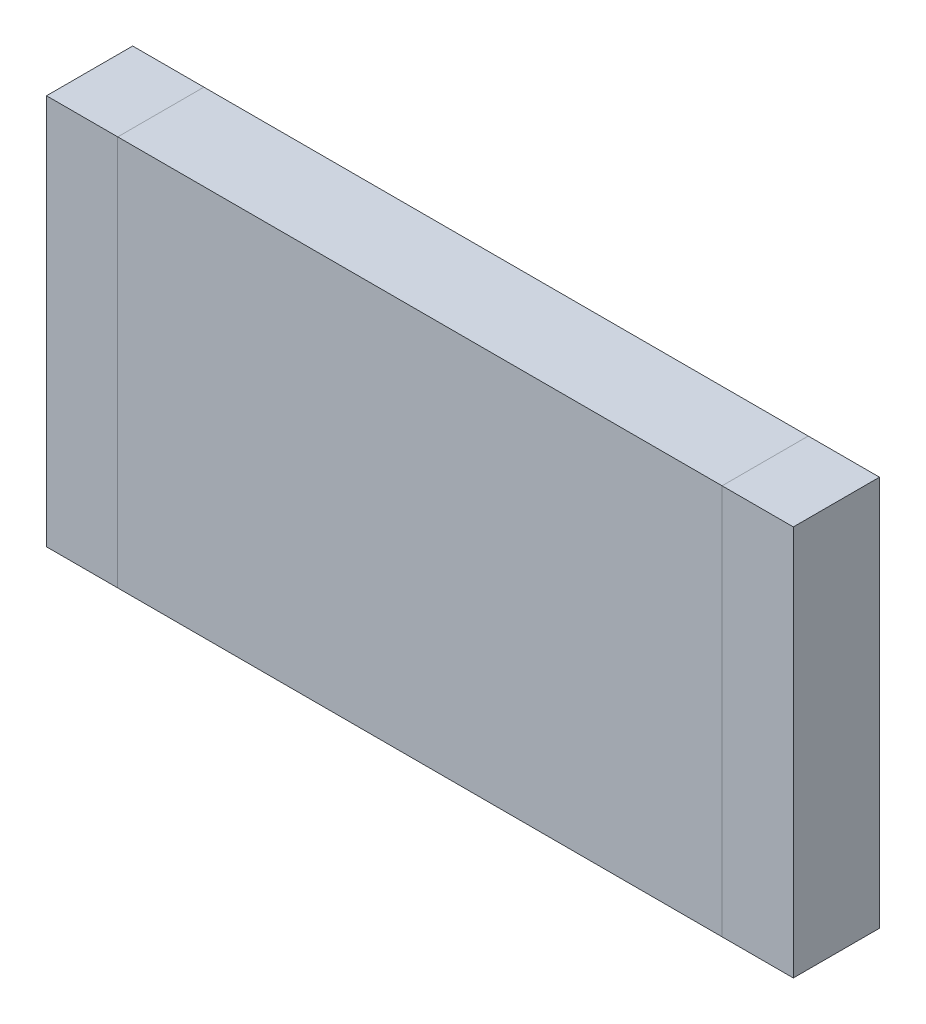
ISO-10303-21;
HEADER;
FILE_DESCRIPTION(('STEP AP214'),'2;1');
FILE_NAME('part.step','',(''),(''),'','','');
FILE_SCHEMA(('AUTOMOTIVE_DESIGN { 1 0 10303 214 1 1 1 1 }'));
ENDSEC;
DATA;
#1=APPLICATION_CONTEXT('core data for automotive mechanical design processes');
#2=APPLICATION_PROTOCOL_DEFINITION('international standard','automotive_design',2000,#1);
#3=PRODUCT_CONTEXT('',#1,'mechanical');
#4=PRODUCT('Part','Part','',(#3));
#5=PRODUCT_RELATED_PRODUCT_CATEGORY('part','',(#4));
#6=PRODUCT_DEFINITION_FORMATION('','',#4);
#7=PRODUCT_DEFINITION_CONTEXT('part definition',#1,'design');
#8=PRODUCT_DEFINITION('design','',#6,#7);
#9=PRODUCT_DEFINITION_SHAPE('','',#8);
#10=(LENGTH_UNIT() NAMED_UNIT(*) SI_UNIT(.MILLI.,.METRE.));
#11=(NAMED_UNIT(*) PLANE_ANGLE_UNIT() SI_UNIT($,.RADIAN.));
#12=(NAMED_UNIT(*) SI_UNIT($,.STERADIAN.) SOLID_ANGLE_UNIT());
#13=UNCERTAINTY_MEASURE_WITH_UNIT(LENGTH_MEASURE(1.E-05),#10,'distance_accuracy_value','');
#14=(GEOMETRIC_REPRESENTATION_CONTEXT(3) GLOBAL_UNCERTAINTY_ASSIGNED_CONTEXT((#13)) GLOBAL_UNIT_ASSIGNED_CONTEXT((#10,
#11,#12)) REPRESENTATION_CONTEXT('',''));
#15=CARTESIAN_POINT('',(0.,0.,0.));
#16=DIRECTION('',(0.,0.,1.));
#17=DIRECTION('',(1.,0.,0.));
#18=AXIS2_PLACEMENT_3D('',#15,#16,#17);
#19=CARTESIAN_POINT('',(-3.2499173,-1.69991786,0.));
#20=DIRECTION('',(-1.,0.,0.));
#21=DIRECTION('',(0.,1.,0.));
#22=AXIS2_PLACEMENT_3D('',#19,#20,#21);
#23=PLANE('',#22);
#24=DIRECTION('',(0.,0.,1.));
#25=VECTOR('',#24,1.);
#26=CARTESIAN_POINT('',(-3.2499173,-1.69991786,0.));
#27=LINE('',#26,#25);
#28=CARTESIAN_POINT('',(-3.2499173,-1.69991786,0.));
#29=VERTEX_POINT('',#28);
#30=CARTESIAN_POINT('',(-3.2499173,-1.69991786,0.75000104));
#31=VERTEX_POINT('',#30);
#32=EDGE_CURVE('P0_E11',#29,#31,#27,.T.);
#33=ORIENTED_EDGE('',*,*,#32,.T.);
#34=DIRECTION('',(0.,1.,0.));
#35=VECTOR('',#34,1.);
#36=CARTESIAN_POINT('',(-3.2499173,-1.69991786,0.75000104));
#37=LINE('',#36,#35);
#38=CARTESIAN_POINT('',(-3.2499173,1.70008042,0.75000104));
#39=VERTEX_POINT('',#38);
#40=EDGE_CURVE('P0_E24',#31,#39,#37,.T.);
#41=ORIENTED_EDGE('',*,*,#40,.T.);
#42=DIRECTION('',(0.,0.,1.));
#43=VECTOR('',#42,1.);
#44=CARTESIAN_POINT('',(-3.2499173,1.70008042,0.));
#45=LINE('',#44,#43);
#46=CARTESIAN_POINT('',(-3.2499173,1.70008042,0.));
#47=VERTEX_POINT('',#46);
#48=EDGE_CURVE('P0_E85',#47,#39,#45,.T.);
#49=ORIENTED_EDGE('',*,*,#48,.F.);
#50=DIRECTION('',(0.,1.,0.));
#51=VECTOR('',#50,1.);
#52=CARTESIAN_POINT('',(-3.2499173,-1.69991786,0.));
#53=LINE('',#52,#51);
#54=EDGE_CURVE('P0_E83',#29,#47,#53,.T.);
#55=ORIENTED_EDGE('',*,*,#54,.F.);
#56=EDGE_LOOP('',(#33,#41,#49,#55));
#57=FACE_BOUND('',#56,.T.);
#58=ADVANCED_FACE('P0_F17',(#57),#23,.T.);
#59=CARTESIAN_POINT('',(-3.2499173,1.70008042,0.));
#60=DIRECTION('',(0.,1.,0.));
#61=DIRECTION('',(1.,0.,0.));
#62=AXIS2_PLACEMENT_3D('',#59,#60,#61);
#63=PLANE('',#62);
#64=ORIENTED_EDGE('',*,*,#48,.T.);
#65=DIRECTION('',(1.,0.,0.));
#66=VECTOR('',#65,1.);
#67=CARTESIAN_POINT('',(-3.2499173,1.70008042,0.75000104));
#68=LINE('',#67,#66);
#69=CARTESIAN_POINT('',(-2.62991854,1.70008042,0.75000104));
#70=VERTEX_POINT('',#69);
#71=EDGE_CURVE('P0_E81',#39,#70,#68,.T.);
#72=ORIENTED_EDGE('',*,*,#71,.T.);
#73=DIRECTION('',(0.,0.,1.));
#74=VECTOR('',#73,1.);
#75=CARTESIAN_POINT('',(-2.62991854,1.70008042,0.));
#76=LINE('',#75,#74);
#77=CARTESIAN_POINT('',(-2.62991854,1.70008042,0.));
#78=VERTEX_POINT('',#77);
#79=EDGE_CURVE('P0_E79',#78,#70,#76,.T.);
#80=ORIENTED_EDGE('',*,*,#79,.F.);
#81=DIRECTION('',(1.,0.,0.));
#82=VECTOR('',#81,1.);
#83=CARTESIAN_POINT('',(-3.2499173,1.70008042,0.));
#84=LINE('',#83,#82);
#85=EDGE_CURVE('P0_E70',#47,#78,#84,.T.);
#86=ORIENTED_EDGE('',*,*,#85,.F.);
#87=EDGE_LOOP('',(#64,#72,#80,#86));
#88=FACE_BOUND('',#87,.T.);
#89=ADVANCED_FACE('P0_F90',(#88),#63,.T.);
#90=CARTESIAN_POINT('',(-2.62991854,1.70008042,0.));
#91=DIRECTION('',(1.,0.,0.));
#92=DIRECTION('',(0.,-1.,0.));
#93=AXIS2_PLACEMENT_3D('',#90,#91,#92);
#94=PLANE('',#93);
#95=ORIENTED_EDGE('',*,*,#79,.T.);
#96=DIRECTION('',(0.,-1.,0.));
#97=VECTOR('',#96,1.);
#98=CARTESIAN_POINT('',(-2.62991854,1.70008042,0.75000104));
#99=LINE('',#98,#97);
#100=CARTESIAN_POINT('',(-2.62991854,-1.69991786,0.75000104));
#101=VERTEX_POINT('',#100);
#102=EDGE_CURVE('P0_E60',#70,#101,#99,.T.);
#103=ORIENTED_EDGE('',*,*,#102,.T.);
#104=DIRECTION('',(0.,0.,1.));
#105=VECTOR('',#104,1.);
#106=CARTESIAN_POINT('',(-2.62991854,-1.69991786,0.));
#107=LINE('',#106,#105);
#108=CARTESIAN_POINT('',(-2.62991854,-1.69991786,0.));
#109=VERTEX_POINT('',#108);
#110=EDGE_CURVE('P0_E54',#109,#101,#107,.T.);
#111=ORIENTED_EDGE('',*,*,#110,.F.);
#112=DIRECTION('',(0.,-1.,0.));
#113=VECTOR('',#112,1.);
#114=CARTESIAN_POINT('',(-2.62991854,1.70008042,0.));
#115=LINE('',#114,#113);
#116=EDGE_CURVE('P0_E58',#78,#109,#115,.T.);
#117=ORIENTED_EDGE('',*,*,#116,.F.);
#118=EDGE_LOOP('',(#95,#103,#111,#117));
#119=FACE_BOUND('',#118,.T.);
#120=ADVANCED_FACE('P0_F57',(#119),#94,.T.);
#121=CARTESIAN_POINT('',(-2.62991854,-1.69991786,0.));
#122=DIRECTION('',(0.,-1.,0.));
#123=DIRECTION('',(-1.,0.,0.));
#124=AXIS2_PLACEMENT_3D('',#121,#122,#123);
#125=PLANE('',#124);
#126=ORIENTED_EDGE('',*,*,#110,.T.);
#127=DIRECTION('',(-1.,0.,0.));
#128=VECTOR('',#127,1.);
#129=CARTESIAN_POINT('',(-2.62991854,-1.69991786,0.75000104));
#130=LINE('',#129,#128);
#131=EDGE_CURVE('P0_E71',#101,#31,#130,.T.);
#132=ORIENTED_EDGE('',*,*,#131,.T.);
#133=ORIENTED_EDGE('',*,*,#32,.F.);
#134=DIRECTION('',(-1.,0.,0.));
#135=VECTOR('',#134,1.);
#136=CARTESIAN_POINT('',(-2.62991854,-1.69991786,0.));
#137=LINE('',#136,#135);
#138=EDGE_CURVE('P0_E68',#109,#29,#137,.T.);
#139=ORIENTED_EDGE('',*,*,#138,.F.);
#140=EDGE_LOOP('',(#126,#132,#133,#139));
#141=FACE_BOUND('',#140,.T.);
#142=ADVANCED_FACE('P0_F73',(#141),#125,.T.);
#143=CARTESIAN_POINT('',(-2.93991792,8.12800000016847E-05,0.));
#144=DIRECTION('',(0.,0.,-1.));
#145=DIRECTION('',(0.,1.,0.));
#146=AXIS2_PLACEMENT_3D('',#143,#144,#145);
#147=PLANE('',#146);
#148=ORIENTED_EDGE('',*,*,#54,.T.);
#149=ORIENTED_EDGE('',*,*,#85,.T.);
#150=ORIENTED_EDGE('',*,*,#116,.T.);
#151=ORIENTED_EDGE('',*,*,#138,.T.);
#152=EDGE_LOOP('',(#148,#149,#150,#151));
#153=FACE_BOUND('',#152,.T.);
#154=ADVANCED_FACE('P0_F67',(#153),#147,.T.);
#155=CARTESIAN_POINT('',(-2.93991792,8.12800000016847E-05,0.75000104));
#156=DIRECTION('',(0.,0.,-1.));
#157=DIRECTION('',(0.,1.,0.));
#158=AXIS2_PLACEMENT_3D('',#155,#156,#157);
#159=PLANE('',#158);
#160=ORIENTED_EDGE('',*,*,#131,.F.);
#161=ORIENTED_EDGE('',*,*,#102,.F.);
#162=ORIENTED_EDGE('',*,*,#71,.F.);
#163=ORIENTED_EDGE('',*,*,#40,.F.);
#164=EDGE_LOOP('',(#160,#161,#162,#163));
#165=FACE_BOUND('',#164,.T.);
#166=ADVANCED_FACE('P0_F91',(#165),#159,.F.);
#167=CLOSED_SHELL('',(#58,#89,#120,#142,#154,#166));
#168=MANIFOLD_SOLID_BREP('P0_B1',#167);
#169=CARTESIAN_POINT('',(-2.62991854,-1.69991786,0.));
#170=DIRECTION('',(-1.,0.,0.));
#171=DIRECTION('',(0.,1.,0.));
#172=AXIS2_PLACEMENT_3D('',#169,#170,#171);
#173=PLANE('',#172);
#174=DIRECTION('',(0.,0.,1.));
#175=VECTOR('',#174,1.);
#176=CARTESIAN_POINT('',(-2.62991854,-1.69991786,0.));
#177=LINE('',#176,#175);
#178=CARTESIAN_POINT('',(-2.62991854,-1.69991786,0.));
#179=VERTEX_POINT('',#178);
#180=CARTESIAN_POINT('',(-2.62991854,-1.69991786,0.75000104));
#181=VERTEX_POINT('',#180);
#182=EDGE_CURVE('P1_E11',#179,#181,#177,.T.);
#183=ORIENTED_EDGE('',*,*,#182,.T.);
#184=DIRECTION('',(0.,1.,0.));
#185=VECTOR('',#184,1.);
#186=CARTESIAN_POINT('',(-2.62991854,-1.69991786,0.75000104));
#187=LINE('',#186,#185);
#188=CARTESIAN_POINT('',(-2.62991854,1.70008042,0.75000104));
#189=VERTEX_POINT('',#188);
#190=EDGE_CURVE('P1_E24',#181,#189,#187,.T.);
#191=ORIENTED_EDGE('',*,*,#190,.T.);
#192=DIRECTION('',(0.,0.,1.));
#193=VECTOR('',#192,1.);
#194=CARTESIAN_POINT('',(-2.62991854,1.70008042,0.));
#195=LINE('',#194,#193);
#196=CARTESIAN_POINT('',(-2.62991854,1.70008042,0.));
#197=VERTEX_POINT('',#196);
#198=EDGE_CURVE('P1_E85',#197,#189,#195,.T.);
#199=ORIENTED_EDGE('',*,*,#198,.F.);
#200=DIRECTION('',(0.,1.,0.));
#201=VECTOR('',#200,1.);
#202=CARTESIAN_POINT('',(-2.62991854,-1.69991786,0.));
#203=LINE('',#202,#201);
#204=EDGE_CURVE('P1_E83',#179,#197,#203,.T.);
#205=ORIENTED_EDGE('',*,*,#204,.F.);
#206=EDGE_LOOP('',(#183,#191,#199,#205));
#207=FACE_BOUND('',#206,.T.);
#208=ADVANCED_FACE('P1_F17',(#207),#173,.T.);
#209=CARTESIAN_POINT('',(-2.62991854,1.70008042,0.));
#210=DIRECTION('',(0.,1.,0.));
#211=DIRECTION('',(1.,0.,0.));
#212=AXIS2_PLACEMENT_3D('',#209,#210,#211);
#213=PLANE('',#212);
#214=ORIENTED_EDGE('',*,*,#198,.T.);
#215=DIRECTION('',(1.,0.,0.));
#216=VECTOR('',#215,1.);
#217=CARTESIAN_POINT('',(-2.62991854,1.70008042,0.75000104));
#218=LINE('',#217,#216);
#219=CARTESIAN_POINT('',(2.6300811,1.70008042,0.75000104));
#220=VERTEX_POINT('',#219);
#221=EDGE_CURVE('P1_E81',#189,#220,#218,.T.);
#222=ORIENTED_EDGE('',*,*,#221,.T.);
#223=DIRECTION('',(0.,0.,1.));
#224=VECTOR('',#223,1.);
#225=CARTESIAN_POINT('',(2.6300811,1.70008042,0.));
#226=LINE('',#225,#224);
#227=CARTESIAN_POINT('',(2.6300811,1.70008042,0.));
#228=VERTEX_POINT('',#227);
#229=EDGE_CURVE('P1_E79',#228,#220,#226,.T.);
#230=ORIENTED_EDGE('',*,*,#229,.F.);
#231=DIRECTION('',(1.,0.,0.));
#232=VECTOR('',#231,1.);
#233=CARTESIAN_POINT('',(-2.62991854,1.70008042,0.));
#234=LINE('',#233,#232);
#235=EDGE_CURVE('P1_E70',#197,#228,#234,.T.);
#236=ORIENTED_EDGE('',*,*,#235,.F.);
#237=EDGE_LOOP('',(#214,#222,#230,#236));
#238=FACE_BOUND('',#237,.T.);
#239=ADVANCED_FACE('P1_F90',(#238),#213,.T.);
#240=CARTESIAN_POINT('',(2.6300811,1.70008042,0.));
#241=DIRECTION('',(1.,0.,0.));
#242=DIRECTION('',(0.,-1.,0.));
#243=AXIS2_PLACEMENT_3D('',#240,#241,#242);
#244=PLANE('',#243);
#245=ORIENTED_EDGE('',*,*,#229,.T.);
#246=DIRECTION('',(0.,-1.,0.));
#247=VECTOR('',#246,1.);
#248=CARTESIAN_POINT('',(2.6300811,1.70008042,0.75000104));
#249=LINE('',#248,#247);
#250=CARTESIAN_POINT('',(2.6300811,-1.69991786,0.75000104));
#251=VERTEX_POINT('',#250);
#252=EDGE_CURVE('P1_E60',#220,#251,#249,.T.);
#253=ORIENTED_EDGE('',*,*,#252,.T.);
#254=DIRECTION('',(0.,0.,1.));
#255=VECTOR('',#254,1.);
#256=CARTESIAN_POINT('',(2.6300811,-1.69991786,0.));
#257=LINE('',#256,#255);
#258=CARTESIAN_POINT('',(2.6300811,-1.69991786,0.));
#259=VERTEX_POINT('',#258);
#260=EDGE_CURVE('P1_E54',#259,#251,#257,.T.);
#261=ORIENTED_EDGE('',*,*,#260,.F.);
#262=DIRECTION('',(0.,-1.,0.));
#263=VECTOR('',#262,1.);
#264=CARTESIAN_POINT('',(2.6300811,1.70008042,0.));
#265=LINE('',#264,#263);
#266=EDGE_CURVE('P1_E58',#228,#259,#265,.T.);
#267=ORIENTED_EDGE('',*,*,#266,.F.);
#268=EDGE_LOOP('',(#245,#253,#261,#267));
#269=FACE_BOUND('',#268,.T.);
#270=ADVANCED_FACE('P1_F57',(#269),#244,.T.);
#271=CARTESIAN_POINT('',(2.6300811,-1.69991786,0.));
#272=DIRECTION('',(0.,-1.,0.));
#273=DIRECTION('',(-1.,0.,0.));
#274=AXIS2_PLACEMENT_3D('',#271,#272,#273);
#275=PLANE('',#274);
#276=ORIENTED_EDGE('',*,*,#260,.T.);
#277=DIRECTION('',(-1.,0.,0.));
#278=VECTOR('',#277,1.);
#279=CARTESIAN_POINT('',(2.6300811,-1.69991786,0.75000104));
#280=LINE('',#279,#278);
#281=EDGE_CURVE('P1_E71',#251,#181,#280,.T.);
#282=ORIENTED_EDGE('',*,*,#281,.T.);
#283=ORIENTED_EDGE('',*,*,#182,.F.);
#284=DIRECTION('',(-1.,0.,0.));
#285=VECTOR('',#284,1.);
#286=CARTESIAN_POINT('',(2.6300811,-1.69991786,0.));
#287=LINE('',#286,#285);
#288=EDGE_CURVE('P1_E68',#259,#179,#287,.T.);
#289=ORIENTED_EDGE('',*,*,#288,.F.);
#290=EDGE_LOOP('',(#276,#282,#283,#289));
#291=FACE_BOUND('',#290,.T.);
#292=ADVANCED_FACE('P1_F73',(#291),#275,.T.);
#293=CARTESIAN_POINT('',(8.12799999982565E-05,8.12800000017435E-05,0.));
#294=DIRECTION('',(0.,0.,-1.));
#295=DIRECTION('',(0.,1.,0.));
#296=AXIS2_PLACEMENT_3D('',#293,#294,#295);
#297=PLANE('',#296);
#298=ORIENTED_EDGE('',*,*,#204,.T.);
#299=ORIENTED_EDGE('',*,*,#235,.T.);
#300=ORIENTED_EDGE('',*,*,#266,.T.);
#301=ORIENTED_EDGE('',*,*,#288,.T.);
#302=EDGE_LOOP('',(#298,#299,#300,#301));
#303=FACE_BOUND('',#302,.T.);
#304=ADVANCED_FACE('P1_F67',(#303),#297,.T.);
#305=CARTESIAN_POINT('',(8.12799999982565E-05,8.12800000017435E-05,0.75000104));
#306=DIRECTION('',(0.,0.,-1.));
#307=DIRECTION('',(0.,1.,0.));
#308=AXIS2_PLACEMENT_3D('',#305,#306,#307);
#309=PLANE('',#308);
#310=ORIENTED_EDGE('',*,*,#281,.F.);
#311=ORIENTED_EDGE('',*,*,#252,.F.);
#312=ORIENTED_EDGE('',*,*,#221,.F.);
#313=ORIENTED_EDGE('',*,*,#190,.F.);
#314=EDGE_LOOP('',(#310,#311,#312,#313));
#315=FACE_BOUND('',#314,.T.);
#316=ADVANCED_FACE('P1_F91',(#315),#309,.F.);
#317=CLOSED_SHELL('',(#208,#239,#270,#292,#304,#316));
#318=MANIFOLD_SOLID_BREP('P1_B1',#317);
#319=CARTESIAN_POINT('',(2.6300811,-1.69991786,0.));
#320=DIRECTION('',(-1.,0.,0.));
#321=DIRECTION('',(0.,1.,0.));
#322=AXIS2_PLACEMENT_3D('',#319,#320,#321);
#323=PLANE('',#322);
#324=DIRECTION('',(0.,0.,1.));
#325=VECTOR('',#324,1.);
#326=CARTESIAN_POINT('',(2.6300811,-1.69991786,0.));
#327=LINE('',#326,#325);
#328=CARTESIAN_POINT('',(2.6300811,-1.69991786,0.));
#329=VERTEX_POINT('',#328);
#330=CARTESIAN_POINT('',(2.6300811,-1.69991786,0.75000104));
#331=VERTEX_POINT('',#330);
#332=EDGE_CURVE('P2_E10',#329,#331,#327,.T.);
#333=ORIENTED_EDGE('',*,*,#332,.T.);
#334=DIRECTION('',(0.,1.,0.));
#335=VECTOR('',#334,1.);
#336=CARTESIAN_POINT('',(2.6300811,-1.69991786,0.75000104));
#337=LINE('',#336,#335);
#338=CARTESIAN_POINT('',(2.6300811,1.70008042,0.75000104));
#339=VERTEX_POINT('',#338);
#340=EDGE_CURVE('P2_E23',#331,#339,#337,.T.);
#341=ORIENTED_EDGE('',*,*,#340,.T.);
#342=DIRECTION('',(0.,0.,1.));
#343=VECTOR('',#342,1.);
#344=CARTESIAN_POINT('',(2.6300811,1.70008042,0.));
#345=LINE('',#344,#343);
#346=CARTESIAN_POINT('',(2.6300811,1.70008042,0.));
#347=VERTEX_POINT('',#346);
#348=EDGE_CURVE('P2_E83',#347,#339,#345,.T.);
#349=ORIENTED_EDGE('',*,*,#348,.F.);
#350=DIRECTION('',(0.,1.,0.));
#351=VECTOR('',#350,1.);
#352=CARTESIAN_POINT('',(2.6300811,-1.69991786,0.));
#353=LINE('',#352,#351);
#354=EDGE_CURVE('P2_E81',#329,#347,#353,.T.);
#355=ORIENTED_EDGE('',*,*,#354,.F.);
#356=EDGE_LOOP('',(#333,#341,#349,#355));
#357=FACE_BOUND('',#356,.T.);
#358=ADVANCED_FACE('P2_F16',(#357),#323,.T.);
#359=CARTESIAN_POINT('',(2.6300811,1.70008042,0.));
#360=DIRECTION('',(0.,1.,0.));
#361=DIRECTION('',(1.,0.,0.));
#362=AXIS2_PLACEMENT_3D('',#359,#360,#361);
#363=PLANE('',#362);
#364=ORIENTED_EDGE('',*,*,#348,.T.);
#365=DIRECTION('',(1.,0.,0.));
#366=VECTOR('',#365,1.);
#367=CARTESIAN_POINT('',(2.6300811,1.70008042,0.75000104));
#368=LINE('',#367,#366);
#369=CARTESIAN_POINT('',(3.25007986,1.70008042,0.75000104));
#370=VERTEX_POINT('',#369);
#371=EDGE_CURVE('P2_E78',#339,#370,#368,.T.);
#372=ORIENTED_EDGE('',*,*,#371,.T.);
#373=DIRECTION('',(0.,0.,1.));
#374=VECTOR('',#373,1.);
#375=CARTESIAN_POINT('',(3.25007986,1.70008042,0.));
#376=LINE('',#375,#374);
#377=CARTESIAN_POINT('',(3.25007986,1.70008042,0.));
#378=VERTEX_POINT('',#377);
#379=EDGE_CURVE('P2_E76',#378,#370,#376,.T.);
#380=ORIENTED_EDGE('',*,*,#379,.F.);
#381=DIRECTION('',(1.,0.,0.));
#382=VECTOR('',#381,1.);
#383=CARTESIAN_POINT('',(2.6300811,1.70008042,0.));
#384=LINE('',#383,#382);
#385=EDGE_CURVE('P2_E67',#347,#378,#384,.T.);
#386=ORIENTED_EDGE('',*,*,#385,.F.);
#387=EDGE_LOOP('',(#364,#372,#380,#386));
#388=FACE_BOUND('',#387,.T.);
#389=ADVANCED_FACE('P2_F89',(#388),#363,.T.);
#390=CARTESIAN_POINT('',(3.25007986,1.70008042,0.));
#391=DIRECTION('',(1.,0.,0.));
#392=DIRECTION('',(0.,-1.,0.));
#393=AXIS2_PLACEMENT_3D('',#390,#391,#392);
#394=PLANE('',#393);
#395=ORIENTED_EDGE('',*,*,#379,.T.);
#396=DIRECTION('',(0.,-1.,0.));
#397=VECTOR('',#396,1.);
#398=CARTESIAN_POINT('',(3.25007986,1.70008042,0.75000104));
#399=LINE('',#398,#397);
#400=CARTESIAN_POINT('',(3.25007986,-1.69991786,0.75000104));
#401=VERTEX_POINT('',#400);
#402=EDGE_CURVE('P2_E59',#370,#401,#399,.T.);
#403=ORIENTED_EDGE('',*,*,#402,.T.);
#404=DIRECTION('',(0.,0.,1.));
#405=VECTOR('',#404,1.);
#406=CARTESIAN_POINT('',(3.25007986,-1.69991786,0.));
#407=LINE('',#406,#405);
#408=CARTESIAN_POINT('',(3.25007986,-1.69991786,0.));
#409=VERTEX_POINT('',#408);
#410=EDGE_CURVE('P2_E53',#409,#401,#407,.T.);
#411=ORIENTED_EDGE('',*,*,#410,.F.);
#412=DIRECTION('',(0.,-1.,0.));
#413=VECTOR('',#412,1.);
#414=CARTESIAN_POINT('',(3.25007986,1.70008042,0.));
#415=LINE('',#414,#413);
#416=EDGE_CURVE('P2_E57',#378,#409,#415,.T.);
#417=ORIENTED_EDGE('',*,*,#416,.F.);
#418=EDGE_LOOP('',(#395,#403,#411,#417));
#419=FACE_BOUND('',#418,.T.);
#420=ADVANCED_FACE('P2_F56',(#419),#394,.T.);
#421=CARTESIAN_POINT('',(3.25007986,-1.69991786,0.));
#422=DIRECTION('',(0.,-1.,0.));
#423=DIRECTION('',(-1.,0.,0.));
#424=AXIS2_PLACEMENT_3D('',#421,#422,#423);
#425=PLANE('',#424);
#426=ORIENTED_EDGE('',*,*,#410,.T.);
#427=DIRECTION('',(-1.,0.,0.));
#428=VECTOR('',#427,1.);
#429=CARTESIAN_POINT('',(3.25007986,-1.69991786,0.75000104));
#430=LINE('',#429,#428);
#431=EDGE_CURVE('P2_E68',#401,#331,#430,.T.);
#432=ORIENTED_EDGE('',*,*,#431,.T.);
#433=ORIENTED_EDGE('',*,*,#332,.F.);
#434=DIRECTION('',(-1.,0.,0.));
#435=VECTOR('',#434,1.);
#436=CARTESIAN_POINT('',(3.25007986,-1.69991786,0.));
#437=LINE('',#436,#435);
#438=EDGE_CURVE('P2_E66',#409,#329,#437,.T.);
#439=ORIENTED_EDGE('',*,*,#438,.F.);
#440=EDGE_LOOP('',(#426,#432,#433,#439));
#441=FACE_BOUND('',#440,.T.);
#442=ADVANCED_FACE('P2_F70',(#441),#425,.T.);
#443=CARTESIAN_POINT('',(2.94008048,8.12800000016847E-05,0.));
#444=DIRECTION('',(0.,0.,-1.));
#445=DIRECTION('',(0.,1.,0.));
#446=AXIS2_PLACEMENT_3D('',#443,#444,#445);
#447=PLANE('',#446);
#448=ORIENTED_EDGE('',*,*,#354,.T.);
#449=ORIENTED_EDGE('',*,*,#385,.T.);
#450=ORIENTED_EDGE('',*,*,#416,.T.);
#451=ORIENTED_EDGE('',*,*,#438,.T.);
#452=EDGE_LOOP('',(#448,#449,#450,#451));
#453=FACE_BOUND('',#452,.T.);
#454=ADVANCED_FACE('P2_F65',(#453),#447,.T.);
#455=CARTESIAN_POINT('',(2.94008048,8.12800000016847E-05,0.75000104));
#456=DIRECTION('',(0.,0.,-1.));
#457=DIRECTION('',(0.,1.,0.));
#458=AXIS2_PLACEMENT_3D('',#455,#456,#457);
#459=PLANE('',#458);
#460=ORIENTED_EDGE('',*,*,#431,.F.);
#461=ORIENTED_EDGE('',*,*,#402,.F.);
#462=ORIENTED_EDGE('',*,*,#371,.F.);
#463=ORIENTED_EDGE('',*,*,#340,.F.);
#464=EDGE_LOOP('',(#460,#461,#462,#463));
#465=FACE_BOUND('',#464,.T.);
#466=ADVANCED_FACE('P2_F90',(#465),#459,.F.);
#467=CLOSED_SHELL('',(#358,#389,#420,#442,#454,#466));
#468=MANIFOLD_SOLID_BREP('P2_B1',#467);
#469=ADVANCED_BREP_SHAPE_REPRESENTATION('',(#18,#168,#318,#468),#14);
#470=SHAPE_DEFINITION_REPRESENTATION(#9,#469);
ENDSEC;
END-ISO-10303-21;
